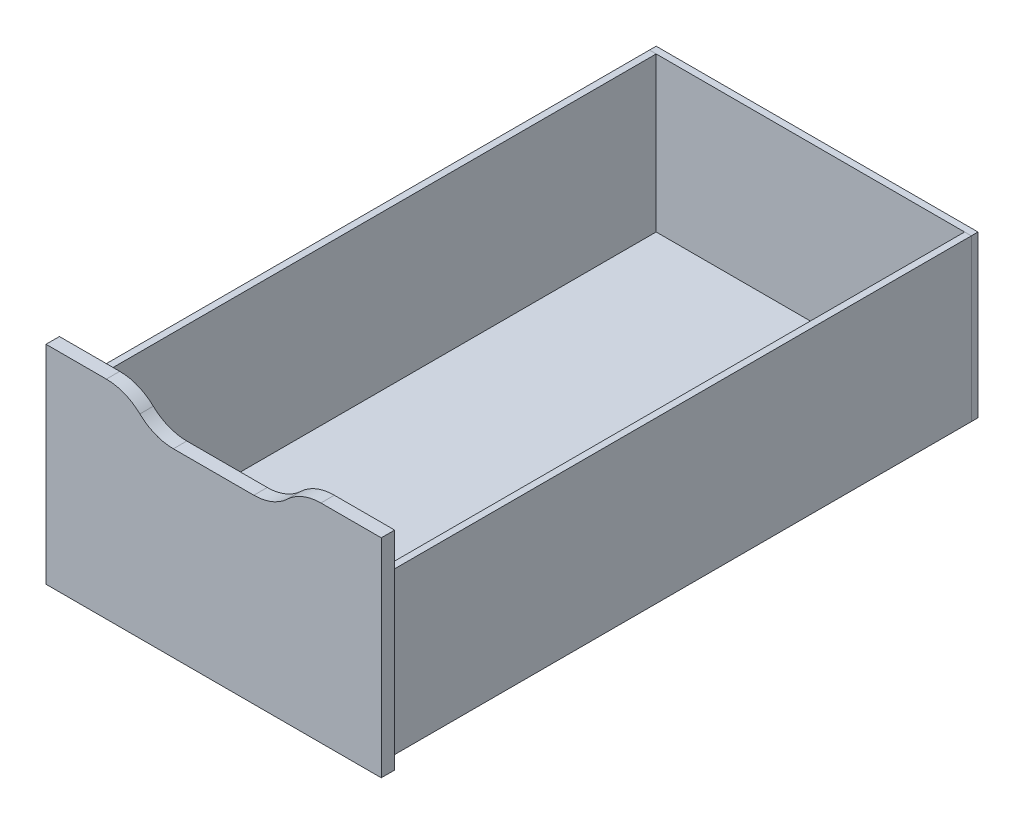
ISO-10303-21;
HEADER;
FILE_DESCRIPTION(('STEP AP214'),'2;1');
FILE_NAME('part.step','',(''),(''),'','','');
FILE_SCHEMA(('AUTOMOTIVE_DESIGN { 1 0 10303 214 1 1 1 1 }'));
ENDSEC;
DATA;
#1=APPLICATION_CONTEXT('core data for automotive mechanical design processes');
#2=APPLICATION_PROTOCOL_DEFINITION('international standard','automotive_design',2000,#1);
#3=PRODUCT_CONTEXT('',#1,'mechanical');
#4=PRODUCT('Part','Part','',(#3));
#5=PRODUCT_RELATED_PRODUCT_CATEGORY('part','',(#4));
#6=PRODUCT_DEFINITION_FORMATION('','',#4);
#7=PRODUCT_DEFINITION_CONTEXT('part definition',#1,'design');
#8=PRODUCT_DEFINITION('design','',#6,#7);
#9=PRODUCT_DEFINITION_SHAPE('','',#8);
#10=(LENGTH_UNIT() NAMED_UNIT(*) SI_UNIT(.MILLI.,.METRE.));
#11=(NAMED_UNIT(*) PLANE_ANGLE_UNIT() SI_UNIT($,.RADIAN.));
#12=(NAMED_UNIT(*) SI_UNIT($,.STERADIAN.) SOLID_ANGLE_UNIT());
#13=UNCERTAINTY_MEASURE_WITH_UNIT(LENGTH_MEASURE(1.E-05),#10,'distance_accuracy_value','');
#14=(GEOMETRIC_REPRESENTATION_CONTEXT(3) GLOBAL_UNCERTAINTY_ASSIGNED_CONTEXT((#13)) GLOBAL_UNIT_ASSIGNED_CONTEXT((#10,
#11,#12)) REPRESENTATION_CONTEXT('',''));
#15=CARTESIAN_POINT('',(0.,0.,0.));
#16=DIRECTION('',(0.,0.,1.));
#17=DIRECTION('',(1.,0.,0.));
#18=AXIS2_PLACEMENT_3D('',#15,#16,#17);
#19=CARTESIAN_POINT('',(152.4,0.,-279.4));
#20=DIRECTION('',(-1.,0.,0.));
#21=DIRECTION('',(0.,0.,1.));
#22=AXIS2_PLACEMENT_3D('',#19,#20,#21);
#23=PLANE('',#22);
#24=DIRECTION('',(0.,-1.,0.));
#25=VECTOR('',#24,1.);
#26=CARTESIAN_POINT('',(152.4,0.,-273.05));
#27=LINE('',#26,#25);
#28=CARTESIAN_POINT('',(152.4,152.4,-273.05));
#29=VERTEX_POINT('',#28);
#30=CARTESIAN_POINT('',(152.4,0.,-273.05));
#31=VERTEX_POINT('',#30);
#32=EDGE_CURVE('E117',#29,#31,#27,.T.);
#33=ORIENTED_EDGE('',*,*,#32,.T.);
#34=DIRECTION('',(0.,0.,1.));
#35=VECTOR('',#34,1.);
#36=CARTESIAN_POINT('',(152.4,0.,-279.4));
#37=LINE('',#36,#35);
#38=CARTESIAN_POINT('',(152.4,0.,-279.4));
#39=VERTEX_POINT('',#38);
#40=EDGE_CURVE('E12',#39,#31,#37,.T.);
#41=ORIENTED_EDGE('',*,*,#40,.F.);
#42=DIRECTION('',(0.,-1.,0.));
#43=VECTOR('',#42,1.);
#44=CARTESIAN_POINT('',(152.4,0.,-279.4));
#45=LINE('',#44,#43);
#46=CARTESIAN_POINT('',(152.4,152.4,-279.4));
#47=VERTEX_POINT('',#46);
#48=EDGE_CURVE('E105',#47,#39,#45,.T.);
#49=ORIENTED_EDGE('',*,*,#48,.F.);
#50=DIRECTION('',(0.,0.,1.));
#51=VECTOR('',#50,1.);
#52=CARTESIAN_POINT('',(152.4,152.4,-279.4));
#53=LINE('',#52,#51);
#54=EDGE_CURVE('E113',#47,#29,#53,.T.);
#55=ORIENTED_EDGE('',*,*,#54,.T.);
#56=EDGE_LOOP('',(#33,#41,#49,#55));
#57=FACE_BOUND('',#56,.T.);
#58=ADVANCED_FACE('F54',(#57),#23,.F.);
#59=CARTESIAN_POINT('',(152.4,0.,-279.4));
#60=DIRECTION('',(0.,1.,0.));
#61=DIRECTION('',(0.,0.,1.));
#62=AXIS2_PLACEMENT_3D('',#59,#60,#61);
#63=PLANE('',#62);
#64=DIRECTION('',(-1.,0.,0.));
#65=VECTOR('',#64,1.);
#66=CARTESIAN_POINT('',(152.4,0.,-273.05));
#67=LINE('',#66,#65);
#68=CARTESIAN_POINT('',(-152.4,0.,-273.05));
#69=VERTEX_POINT('',#68);
#70=EDGE_CURVE('E109',#31,#69,#67,.T.);
#71=ORIENTED_EDGE('',*,*,#70,.T.);
#72=DIRECTION('',(0.,0.,1.));
#73=VECTOR('',#72,1.);
#74=CARTESIAN_POINT('',(-152.4,0.,-279.4));
#75=LINE('',#74,#73);
#76=CARTESIAN_POINT('',(-152.4,0.,-279.4));
#77=VERTEX_POINT('',#76);
#78=EDGE_CURVE('E62',#77,#69,#75,.T.);
#79=ORIENTED_EDGE('',*,*,#78,.F.);
#80=DIRECTION('',(-1.,0.,0.));
#81=VECTOR('',#80,1.);
#82=CARTESIAN_POINT('',(152.4,0.,-279.4));
#83=LINE('',#82,#81);
#84=EDGE_CURVE('E100',#39,#77,#83,.T.);
#85=ORIENTED_EDGE('',*,*,#84,.F.);
#86=ORIENTED_EDGE('',*,*,#40,.T.);
#87=EDGE_LOOP('',(#71,#79,#85,#86));
#88=FACE_BOUND('',#87,.T.);
#89=ADVANCED_FACE('F108',(#88),#63,.F.);
#90=CARTESIAN_POINT('',(-152.4,0.,-279.4));
#91=DIRECTION('',(1.,0.,0.));
#92=DIRECTION('',(0.,0.,-1.));
#93=AXIS2_PLACEMENT_3D('',#90,#91,#92);
#94=PLANE('',#93);
#95=DIRECTION('',(0.,1.,0.));
#96=VECTOR('',#95,1.);
#97=CARTESIAN_POINT('',(-152.4,0.,-273.05));
#98=LINE('',#97,#96);
#99=CARTESIAN_POINT('',(-152.4,152.4,-273.05));
#100=VERTEX_POINT('',#99);
#101=EDGE_CURVE('E87',#69,#100,#98,.T.);
#102=ORIENTED_EDGE('',*,*,#101,.T.);
#103=DIRECTION('',(0.,0.,1.));
#104=VECTOR('',#103,1.);
#105=CARTESIAN_POINT('',(-152.4,152.4,-279.4));
#106=LINE('',#105,#104);
#107=CARTESIAN_POINT('',(-152.4,152.4,-279.4));
#108=VERTEX_POINT('',#107);
#109=EDGE_CURVE('E110',#108,#100,#106,.T.);
#110=ORIENTED_EDGE('',*,*,#109,.F.);
#111=DIRECTION('',(0.,1.,0.));
#112=VECTOR('',#111,1.);
#113=CARTESIAN_POINT('',(-152.4,0.,-279.4));
#114=LINE('',#113,#112);
#115=EDGE_CURVE('E103',#77,#108,#114,.T.);
#116=ORIENTED_EDGE('',*,*,#115,.F.);
#117=ORIENTED_EDGE('',*,*,#78,.T.);
#118=EDGE_LOOP('',(#102,#110,#116,#117));
#119=FACE_BOUND('',#118,.T.);
#120=ADVANCED_FACE('F111',(#119),#94,.F.);
#121=CARTESIAN_POINT('',(152.4,152.4,-279.4));
#122=DIRECTION('',(0.,-1.,0.));
#123=DIRECTION('',(0.,0.,-1.));
#124=AXIS2_PLACEMENT_3D('',#121,#122,#123);
#125=PLANE('',#124);
#126=DIRECTION('',(1.,0.,0.));
#127=VECTOR('',#126,1.);
#128=CARTESIAN_POINT('',(152.4,152.4,-273.05));
#129=LINE('',#128,#127);
#130=EDGE_CURVE('E93',#100,#29,#129,.T.);
#131=ORIENTED_EDGE('',*,*,#130,.T.);
#132=ORIENTED_EDGE('',*,*,#54,.F.);
#133=DIRECTION('',(1.,0.,0.));
#134=VECTOR('',#133,1.);
#135=CARTESIAN_POINT('',(152.4,152.4,-279.4));
#136=LINE('',#135,#134);
#137=EDGE_CURVE('E70',#108,#47,#136,.T.);
#138=ORIENTED_EDGE('',*,*,#137,.F.);
#139=ORIENTED_EDGE('',*,*,#109,.T.);
#140=EDGE_LOOP('',(#131,#132,#138,#139));
#141=FACE_BOUND('',#140,.T.);
#142=ADVANCED_FACE('F124',(#141),#125,.F.);
#143=CARTESIAN_POINT('',(0.,0.,-279.4));
#144=DIRECTION('',(0.,0.,1.));
#145=DIRECTION('',(1.,0.,0.));
#146=AXIS2_PLACEMENT_3D('',#143,#144,#145);
#147=PLANE('',#146);
#148=ORIENTED_EDGE('',*,*,#48,.T.);
#149=ORIENTED_EDGE('',*,*,#84,.T.);
#150=ORIENTED_EDGE('',*,*,#115,.T.);
#151=ORIENTED_EDGE('',*,*,#137,.T.);
#152=EDGE_LOOP('',(#148,#149,#150,#151));
#153=FACE_BOUND('',#152,.T.);
#154=ADVANCED_FACE('F101',(#153),#147,.F.);
#155=CARTESIAN_POINT('',(0.,0.,-273.05));
#156=DIRECTION('',(0.,0.,1.));
#157=DIRECTION('',(1.,0.,0.));
#158=AXIS2_PLACEMENT_3D('',#155,#156,#157);
#159=PLANE('',#158);
#160=ORIENTED_EDGE('',*,*,#32,.F.);
#161=ORIENTED_EDGE('',*,*,#130,.F.);
#162=ORIENTED_EDGE('',*,*,#101,.F.);
#163=ORIENTED_EDGE('',*,*,#70,.F.);
#164=EDGE_LOOP('',(#160,#161,#162,#163));
#165=FACE_BOUND('',#164,.T.);
#166=ADVANCED_FACE('F127',(#165),#159,.T.);
#167=CLOSED_SHELL('',(#58,#89,#120,#142,#154,#166));
#168=MANIFOLD_SOLID_BREP('B2',#167);
#169=CARTESIAN_POINT('',(-152.4,0.,279.4));
#170=DIRECTION('',(0.,0.,-1.));
#171=DIRECTION('',(0.,1.,0.));
#172=AXIS2_PLACEMENT_3D('',#169,#170,#171);
#173=PLANE('',#172);
#174=DIRECTION('',(0.,-1.,0.));
#175=VECTOR('',#174,1.);
#176=CARTESIAN_POINT('',(-146.05,0.,279.4));
#177=LINE('',#176,#175);
#178=CARTESIAN_POINT('',(-146.05,152.4,279.4));
#179=VERTEX_POINT('',#178);
#180=CARTESIAN_POINT('',(-146.05,0.,279.4));
#181=VERTEX_POINT('',#180);
#182=EDGE_CURVE('E263',#179,#181,#177,.T.);
#183=ORIENTED_EDGE('',*,*,#182,.F.);
#184=DIRECTION('',(1.,0.,0.));
#185=VECTOR('',#184,1.);
#186=CARTESIAN_POINT('',(-152.4,152.4,279.4));
#187=LINE('',#186,#185);
#188=CARTESIAN_POINT('',(-152.4,152.4,279.4));
#189=VERTEX_POINT('',#188);
#190=EDGE_CURVE('E262',#189,#179,#187,.T.);
#191=ORIENTED_EDGE('',*,*,#190,.F.);
#192=DIRECTION('',(0.,-1.,0.));
#193=VECTOR('',#192,1.);
#194=CARTESIAN_POINT('',(-152.4,0.,279.4));
#195=LINE('',#194,#193);
#196=CARTESIAN_POINT('',(-152.4,0.,279.4));
#197=VERTEX_POINT('',#196);
#198=EDGE_CURVE('E257',#189,#197,#195,.T.);
#199=ORIENTED_EDGE('',*,*,#198,.T.);
#200=DIRECTION('',(1.,0.,0.));
#201=VECTOR('',#200,1.);
#202=CARTESIAN_POINT('',(-152.4,0.,279.4));
#203=LINE('',#202,#201);
#204=EDGE_CURVE('E52',#197,#181,#203,.T.);
#205=ORIENTED_EDGE('',*,*,#204,.T.);
#206=EDGE_LOOP('',(#183,#191,#199,#205));
#207=FACE_BOUND('',#206,.T.);
#208=ADVANCED_FACE('F200',(#207),#173,.F.);
#209=CARTESIAN_POINT('',(-152.4,0.,279.4));
#210=DIRECTION('',(0.,1.,0.));
#211=DIRECTION('',(0.,0.,1.));
#212=AXIS2_PLACEMENT_3D('',#209,#210,#211);
#213=PLANE('',#212);
#214=DIRECTION('',(0.,0.,-1.));
#215=VECTOR('',#214,1.);
#216=CARTESIAN_POINT('',(-146.05,0.,279.4));
#217=LINE('',#216,#215);
#218=CARTESIAN_POINT('',(-146.05,0.,-273.05));
#219=VERTEX_POINT('',#218);
#220=EDGE_CURVE('E265',#181,#219,#217,.T.);
#221=ORIENTED_EDGE('',*,*,#220,.F.);
#222=ORIENTED_EDGE('',*,*,#204,.F.);
#223=DIRECTION('',(0.,0.,-1.));
#224=VECTOR('',#223,1.);
#225=CARTESIAN_POINT('',(-152.4,0.,279.4));
#226=LINE('',#225,#224);
#227=CARTESIAN_POINT('',(-152.4,0.,-273.05));
#228=VERTEX_POINT('',#227);
#229=EDGE_CURVE('E241',#197,#228,#226,.T.);
#230=ORIENTED_EDGE('',*,*,#229,.T.);
#231=DIRECTION('',(1.,0.,0.));
#232=VECTOR('',#231,1.);
#233=CARTESIAN_POINT('',(-152.4,0.,-273.05));
#234=LINE('',#233,#232);
#235=EDGE_CURVE('E208',#228,#219,#234,.T.);
#236=ORIENTED_EDGE('',*,*,#235,.T.);
#237=EDGE_LOOP('',(#221,#222,#230,#236));
#238=FACE_BOUND('',#237,.T.);
#239=ADVANCED_FACE('F255',(#238),#213,.F.);
#240=CARTESIAN_POINT('',(-152.4,0.,-273.05));
#241=DIRECTION('',(0.,0.,1.));
#242=DIRECTION('',(0.,-1.,0.));
#243=AXIS2_PLACEMENT_3D('',#240,#241,#242);
#244=PLANE('',#243);
#245=DIRECTION('',(0.,1.,0.));
#246=VECTOR('',#245,1.);
#247=CARTESIAN_POINT('',(-146.05,0.,-273.05));
#248=LINE('',#247,#246);
#249=CARTESIAN_POINT('',(-146.05,152.4,-273.05));
#250=VERTEX_POINT('',#249);
#251=EDGE_CURVE('E251',#219,#250,#248,.T.);
#252=ORIENTED_EDGE('',*,*,#251,.F.);
#253=ORIENTED_EDGE('',*,*,#235,.F.);
#254=DIRECTION('',(0.,1.,0.));
#255=VECTOR('',#254,1.);
#256=CARTESIAN_POINT('',(-152.4,0.,-273.05));
#257=LINE('',#256,#255);
#258=CARTESIAN_POINT('',(-152.4,152.4,-273.05));
#259=VERTEX_POINT('',#258);
#260=EDGE_CURVE('E244',#228,#259,#257,.T.);
#261=ORIENTED_EDGE('',*,*,#260,.T.);
#262=DIRECTION('',(1.,0.,0.));
#263=VECTOR('',#262,1.);
#264=CARTESIAN_POINT('',(-152.4,152.4,-273.05));
#265=LINE('',#264,#263);
#266=EDGE_CURVE('E254',#259,#250,#265,.T.);
#267=ORIENTED_EDGE('',*,*,#266,.T.);
#268=EDGE_LOOP('',(#252,#253,#261,#267));
#269=FACE_BOUND('',#268,.T.);
#270=ADVANCED_FACE('F250',(#269),#244,.F.);
#271=CARTESIAN_POINT('',(-152.4,152.4,279.4));
#272=DIRECTION('',(0.,-1.,0.));
#273=DIRECTION('',(0.,0.,-1.));
#274=AXIS2_PLACEMENT_3D('',#271,#272,#273);
#275=PLANE('',#274);
#276=DIRECTION('',(0.,0.,1.));
#277=VECTOR('',#276,1.);
#278=CARTESIAN_POINT('',(-146.05,152.4,279.4));
#279=LINE('',#278,#277);
#280=EDGE_CURVE('E230',#250,#179,#279,.T.);
#281=ORIENTED_EDGE('',*,*,#280,.F.);
#282=ORIENTED_EDGE('',*,*,#266,.F.);
#283=DIRECTION('',(0.,0.,1.));
#284=VECTOR('',#283,1.);
#285=CARTESIAN_POINT('',(-152.4,152.4,279.4));
#286=LINE('',#285,#284);
#287=EDGE_CURVE('E216',#259,#189,#286,.T.);
#288=ORIENTED_EDGE('',*,*,#287,.T.);
#289=ORIENTED_EDGE('',*,*,#190,.T.);
#290=EDGE_LOOP('',(#281,#282,#288,#289));
#291=FACE_BOUND('',#290,.T.);
#292=ADVANCED_FACE('F274',(#291),#275,.F.);
#293=CARTESIAN_POINT('',(-152.4,0.,0.));
#294=DIRECTION('',(1.,0.,0.));
#295=DIRECTION('',(0.,0.,1.));
#296=AXIS2_PLACEMENT_3D('',#293,#294,#295);
#297=PLANE('',#296);
#298=ORIENTED_EDGE('',*,*,#198,.F.);
#299=ORIENTED_EDGE('',*,*,#287,.F.);
#300=ORIENTED_EDGE('',*,*,#260,.F.);
#301=ORIENTED_EDGE('',*,*,#229,.F.);
#302=EDGE_LOOP('',(#298,#299,#300,#301));
#303=FACE_BOUND('',#302,.T.);
#304=ADVANCED_FACE('F246',(#303),#297,.F.);
#305=CARTESIAN_POINT('',(-146.05,0.,0.));
#306=DIRECTION('',(1.,0.,0.));
#307=DIRECTION('',(0.,0.,1.));
#308=AXIS2_PLACEMENT_3D('',#305,#306,#307);
#309=PLANE('',#308);
#310=ORIENTED_EDGE('',*,*,#182,.T.);
#311=ORIENTED_EDGE('',*,*,#220,.T.);
#312=ORIENTED_EDGE('',*,*,#251,.T.);
#313=ORIENTED_EDGE('',*,*,#280,.T.);
#314=EDGE_LOOP('',(#310,#311,#312,#313));
#315=FACE_BOUND('',#314,.T.);
#316=ADVANCED_FACE('F270',(#315),#309,.T.);
#317=CLOSED_SHELL('',(#208,#239,#270,#292,#304,#316));
#318=MANIFOLD_SOLID_BREP('B6',#317);
#319=CARTESIAN_POINT('',(152.4,0.,279.4));
#320=DIRECTION('',(0.,0.,-1.));
#321=DIRECTION('',(0.,1.,0.));
#322=AXIS2_PLACEMENT_3D('',#319,#320,#321);
#323=PLANE('',#322);
#324=DIRECTION('',(0.,-1.,0.));
#325=VECTOR('',#324,1.);
#326=CARTESIAN_POINT('',(146.05,0.,279.4));
#327=LINE('',#326,#325);
#328=CARTESIAN_POINT('',(146.05,152.4,279.4));
#329=VERTEX_POINT('',#328);
#330=CARTESIAN_POINT('',(146.05,0.,279.4));
#331=VERTEX_POINT('',#330);
#332=EDGE_CURVE('E409',#329,#331,#327,.T.);
#333=ORIENTED_EDGE('',*,*,#332,.T.);
#334=DIRECTION('',(-1.,0.,0.));
#335=VECTOR('',#334,1.);
#336=CARTESIAN_POINT('',(152.4,0.,279.4));
#337=LINE('',#336,#335);
#338=CARTESIAN_POINT('',(152.4,0.,279.4));
#339=VERTEX_POINT('',#338);
#340=EDGE_CURVE('E198',#339,#331,#337,.T.);
#341=ORIENTED_EDGE('',*,*,#340,.F.);
#342=DIRECTION('',(0.,-1.,0.));
#343=VECTOR('',#342,1.);
#344=CARTESIAN_POINT('',(152.4,0.,279.4));
#345=LINE('',#344,#343);
#346=CARTESIAN_POINT('',(152.4,152.4,279.4));
#347=VERTEX_POINT('',#346);
#348=EDGE_CURVE('E397',#347,#339,#345,.T.);
#349=ORIENTED_EDGE('',*,*,#348,.F.);
#350=DIRECTION('',(-1.,0.,0.));
#351=VECTOR('',#350,1.);
#352=CARTESIAN_POINT('',(152.4,152.4,279.4));
#353=LINE('',#352,#351);
#354=EDGE_CURVE('E405',#347,#329,#353,.T.);
#355=ORIENTED_EDGE('',*,*,#354,.T.);
#356=EDGE_LOOP('',(#333,#341,#349,#355));
#357=FACE_BOUND('',#356,.T.);
#358=ADVANCED_FACE('F346',(#357),#323,.F.);
#359=CARTESIAN_POINT('',(152.4,0.,279.4));
#360=DIRECTION('',(0.,1.,0.));
#361=DIRECTION('',(0.,0.,1.));
#362=AXIS2_PLACEMENT_3D('',#359,#360,#361);
#363=PLANE('',#362);
#364=DIRECTION('',(0.,0.,-1.));
#365=VECTOR('',#364,1.);
#366=CARTESIAN_POINT('',(146.05,0.,279.4));
#367=LINE('',#366,#365);
#368=CARTESIAN_POINT('',(146.05,0.,-273.05));
#369=VERTEX_POINT('',#368);
#370=EDGE_CURVE('E401',#331,#369,#367,.T.);
#371=ORIENTED_EDGE('',*,*,#370,.T.);
#372=DIRECTION('',(-1.,0.,0.));
#373=VECTOR('',#372,1.);
#374=CARTESIAN_POINT('',(152.4,0.,-273.05));
#375=LINE('',#374,#373);
#376=CARTESIAN_POINT('',(152.4,0.,-273.05));
#377=VERTEX_POINT('',#376);
#378=EDGE_CURVE('E354',#377,#369,#375,.T.);
#379=ORIENTED_EDGE('',*,*,#378,.F.);
#380=DIRECTION('',(0.,0.,-1.));
#381=VECTOR('',#380,1.);
#382=CARTESIAN_POINT('',(152.4,0.,279.4));
#383=LINE('',#382,#381);
#384=EDGE_CURVE('E392',#339,#377,#383,.T.);
#385=ORIENTED_EDGE('',*,*,#384,.F.);
#386=ORIENTED_EDGE('',*,*,#340,.T.);
#387=EDGE_LOOP('',(#371,#379,#385,#386));
#388=FACE_BOUND('',#387,.T.);
#389=ADVANCED_FACE('F400',(#388),#363,.F.);
#390=CARTESIAN_POINT('',(152.4,0.,-273.05));
#391=DIRECTION('',(0.,0.,1.));
#392=DIRECTION('',(0.,-1.,0.));
#393=AXIS2_PLACEMENT_3D('',#390,#391,#392);
#394=PLANE('',#393);
#395=DIRECTION('',(0.,1.,0.));
#396=VECTOR('',#395,1.);
#397=CARTESIAN_POINT('',(146.05,0.,-273.05));
#398=LINE('',#397,#396);
#399=CARTESIAN_POINT('',(146.05,152.4,-273.05));
#400=VERTEX_POINT('',#399);
#401=EDGE_CURVE('E379',#369,#400,#398,.T.);
#402=ORIENTED_EDGE('',*,*,#401,.T.);
#403=DIRECTION('',(-1.,0.,0.));
#404=VECTOR('',#403,1.);
#405=CARTESIAN_POINT('',(152.4,152.4,-273.05));
#406=LINE('',#405,#404);
#407=CARTESIAN_POINT('',(152.4,152.4,-273.05));
#408=VERTEX_POINT('',#407);
#409=EDGE_CURVE('E402',#408,#400,#406,.T.);
#410=ORIENTED_EDGE('',*,*,#409,.F.);
#411=DIRECTION('',(0.,1.,0.));
#412=VECTOR('',#411,1.);
#413=CARTESIAN_POINT('',(152.4,0.,-273.05));
#414=LINE('',#413,#412);
#415=EDGE_CURVE('E395',#377,#408,#414,.T.);
#416=ORIENTED_EDGE('',*,*,#415,.F.);
#417=ORIENTED_EDGE('',*,*,#378,.T.);
#418=EDGE_LOOP('',(#402,#410,#416,#417));
#419=FACE_BOUND('',#418,.T.);
#420=ADVANCED_FACE('F403',(#419),#394,.F.);
#421=CARTESIAN_POINT('',(152.4,152.4,279.4));
#422=DIRECTION('',(0.,-1.,0.));
#423=DIRECTION('',(0.,0.,-1.));
#424=AXIS2_PLACEMENT_3D('',#421,#422,#423);
#425=PLANE('',#424);
#426=DIRECTION('',(0.,0.,1.));
#427=VECTOR('',#426,1.);
#428=CARTESIAN_POINT('',(146.05,152.4,279.4));
#429=LINE('',#428,#427);
#430=EDGE_CURVE('E385',#400,#329,#429,.T.);
#431=ORIENTED_EDGE('',*,*,#430,.T.);
#432=ORIENTED_EDGE('',*,*,#354,.F.);
#433=DIRECTION('',(0.,0.,1.));
#434=VECTOR('',#433,1.);
#435=CARTESIAN_POINT('',(152.4,152.4,279.4));
#436=LINE('',#435,#434);
#437=EDGE_CURVE('E362',#408,#347,#436,.T.);
#438=ORIENTED_EDGE('',*,*,#437,.F.);
#439=ORIENTED_EDGE('',*,*,#409,.T.);
#440=EDGE_LOOP('',(#431,#432,#438,#439));
#441=FACE_BOUND('',#440,.T.);
#442=ADVANCED_FACE('F416',(#441),#425,.F.);
#443=CARTESIAN_POINT('',(152.4,0.,0.));
#444=DIRECTION('',(-1.,0.,0.));
#445=DIRECTION('',(0.,0.,1.));
#446=AXIS2_PLACEMENT_3D('',#443,#444,#445);
#447=PLANE('',#446);
#448=ORIENTED_EDGE('',*,*,#348,.T.);
#449=ORIENTED_EDGE('',*,*,#384,.T.);
#450=ORIENTED_EDGE('',*,*,#415,.T.);
#451=ORIENTED_EDGE('',*,*,#437,.T.);
#452=EDGE_LOOP('',(#448,#449,#450,#451));
#453=FACE_BOUND('',#452,.T.);
#454=ADVANCED_FACE('F393',(#453),#447,.F.);
#455=CARTESIAN_POINT('',(146.05,0.,0.));
#456=DIRECTION('',(-1.,0.,0.));
#457=DIRECTION('',(0.,0.,1.));
#458=AXIS2_PLACEMENT_3D('',#455,#456,#457);
#459=PLANE('',#458);
#460=ORIENTED_EDGE('',*,*,#332,.F.);
#461=ORIENTED_EDGE('',*,*,#430,.F.);
#462=ORIENTED_EDGE('',*,*,#401,.F.);
#463=ORIENTED_EDGE('',*,*,#370,.F.);
#464=EDGE_LOOP('',(#460,#461,#462,#463));
#465=FACE_BOUND('',#464,.T.);
#466=ADVANCED_FACE('F419',(#465),#459,.T.);
#467=CLOSED_SHELL('',(#358,#389,#420,#442,#454,#466));
#468=MANIFOLD_SOLID_BREP('B46',#467);
#469=CARTESIAN_POINT('',(-158.75,190.5,292.1));
#470=DIRECTION('',(0.,-1.,0.));
#471=DIRECTION('',(0.,0.,-1.));
#472=AXIS2_PLACEMENT_3D('',#469,#470,#471);
#473=PLANE('',#472);
#474=DIRECTION('',(0.,0.,1.));
#475=VECTOR('',#474,1.);
#476=CARTESIAN_POINT('',(101.6,190.5,-273.05));
#477=LINE('',#476,#475);
#478=CARTESIAN_POINT('',(101.6,190.5,279.4));
#479=VERTEX_POINT('',#478);
#480=CARTESIAN_POINT('',(101.6,190.5,292.1));
#481=VERTEX_POINT('',#480);
#482=EDGE_CURVE('E602',#479,#481,#477,.T.);
#483=ORIENTED_EDGE('',*,*,#482,.T.);
#484=DIRECTION('',(-1.,0.,0.));
#485=VECTOR('',#484,1.);
#486=CARTESIAN_POINT('',(-158.75,190.5,292.1));
#487=LINE('',#486,#485);
#488=CARTESIAN_POINT('',(158.75,190.5,292.1));
#489=VERTEX_POINT('',#488);
#490=EDGE_CURVE('E592',#489,#481,#487,.T.);
#491=ORIENTED_EDGE('',*,*,#490,.F.);
#492=DIRECTION('',(0.,0.,-1.));
#493=VECTOR('',#492,1.);
#494=CARTESIAN_POINT('',(158.75,190.5,292.1));
#495=LINE('',#494,#493);
#496=CARTESIAN_POINT('',(158.75,190.5,279.4));
#497=VERTEX_POINT('',#496);
#498=EDGE_CURVE('E611',#489,#497,#495,.T.);
#499=ORIENTED_EDGE('',*,*,#498,.T.);
#500=DIRECTION('',(-1.,0.,0.));
#501=VECTOR('',#500,1.);
#502=CARTESIAN_POINT('',(-158.75,190.5,279.4));
#503=LINE('',#502,#501);
#504=EDGE_CURVE('E606',#497,#479,#503,.T.);
#505=ORIENTED_EDGE('',*,*,#504,.T.);
#506=EDGE_LOOP('',(#483,#491,#499,#505));
#507=FACE_BOUND('',#506,.T.);
#508=ADVANCED_FACE('F491',(#507),#473,.F.);
#509=CARTESIAN_POINT('',(0.,0.,292.1));
#510=DIRECTION('',(0.,0.,-1.));
#511=DIRECTION('',(-1.,0.,0.));
#512=AXIS2_PLACEMENT_3D('',#509,#510,#511);
#513=PLANE('',#512);
#514=ORIENTED_EDGE('',*,*,#490,.T.);
#515=CARTESIAN_POINT('',(101.6,144.4625,292.1));
#516=DIRECTION('',(0.,0.,-1.));
#517=DIRECTION('',(1.,0.,0.));
#518=AXIS2_PLACEMENT_3D('',#515,#516,#517);
#519=CIRCLE('',#518,46.0375000000001);
#520=CARTESIAN_POINT('',(69.85,177.8,292.1));
#521=VERTEX_POINT('',#520);
#522=EDGE_CURVE('E581',#521,#481,#519,.T.);
#523=ORIENTED_EDGE('',*,*,#522,.F.);
#524=CARTESIAN_POINT('',(38.1,211.1375,292.1));
#525=DIRECTION('',(0.,0.,1.));
#526=DIRECTION('',(-1.,0.,0.));
#527=AXIS2_PLACEMENT_3D('',#524,#525,#526);
#528=CIRCLE('',#527,46.0375000000001);
#529=CARTESIAN_POINT('',(38.1,165.1,292.1));
#530=VERTEX_POINT('',#529);
#531=EDGE_CURVE('E662',#530,#521,#528,.T.);
#532=ORIENTED_EDGE('',*,*,#531,.F.);
#533=DIRECTION('',(1.,0.,0.));
#534=VECTOR('',#533,1.);
#535=CARTESIAN_POINT('',(38.1,165.1,292.1));
#536=LINE('',#535,#534);
#537=CARTESIAN_POINT('',(-38.1,165.1,292.1));
#538=VERTEX_POINT('',#537);
#539=EDGE_CURVE('E638',#538,#530,#536,.T.);
#540=ORIENTED_EDGE('',*,*,#539,.F.);
#541=CARTESIAN_POINT('',(-38.1,211.1375,292.1));
#542=DIRECTION('',(0.,0.,1.));
#543=DIRECTION('',(-1.,0.,0.));
#544=AXIS2_PLACEMENT_3D('',#541,#542,#543);
#545=CIRCLE('',#544,46.0375000000001);
#546=CARTESIAN_POINT('',(-69.85,177.8,292.1));
#547=VERTEX_POINT('',#546);
#548=EDGE_CURVE('E587',#547,#538,#545,.T.);
#549=ORIENTED_EDGE('',*,*,#548,.F.);
#550=CARTESIAN_POINT('',(-101.6,144.4625,292.1));
#551=DIRECTION('',(0.,0.,-1.));
#552=DIRECTION('',(1.,0.,0.));
#553=AXIS2_PLACEMENT_3D('',#550,#551,#552);
#554=CIRCLE('',#553,46.0375000000001);
#555=CARTESIAN_POINT('',(-101.6,190.5,292.1));
#556=VERTEX_POINT('',#555);
#557=EDGE_CURVE('E577',#556,#547,#554,.T.);
#558=ORIENTED_EDGE('',*,*,#557,.F.);
#559=CARTESIAN_POINT('',(-158.75,190.5,292.1));
#560=VERTEX_POINT('',#559);
#561=EDGE_CURVE('E515',#556,#560,#487,.T.);
#562=ORIENTED_EDGE('',*,*,#561,.T.);
#563=DIRECTION('',(0.,-1.,0.));
#564=VECTOR('',#563,1.);
#565=CARTESIAN_POINT('',(-158.75,-6.35,292.1));
#566=LINE('',#565,#564);
#567=CARTESIAN_POINT('',(-158.75,-6.35,292.1));
#568=VERTEX_POINT('',#567);
#569=EDGE_CURVE('E609',#560,#568,#566,.T.);
#570=ORIENTED_EDGE('',*,*,#569,.T.);
#571=DIRECTION('',(1.,0.,0.));
#572=VECTOR('',#571,1.);
#573=CARTESIAN_POINT('',(-158.75,-6.35,292.1));
#574=LINE('',#573,#572);
#575=CARTESIAN_POINT('',(158.75,-6.35,292.1));
#576=VERTEX_POINT('',#575);
#577=EDGE_CURVE('E545',#568,#576,#574,.T.);
#578=ORIENTED_EDGE('',*,*,#577,.T.);
#579=DIRECTION('',(0.,1.,0.));
#580=VECTOR('',#579,1.);
#581=CARTESIAN_POINT('',(158.75,-6.35,292.1));
#582=LINE('',#581,#580);
#583=EDGE_CURVE('E593',#576,#489,#582,.T.);
#584=ORIENTED_EDGE('',*,*,#583,.T.);
#585=EDGE_LOOP('',(#514,#523,#532,#540,#549,#558,#562,#570,#578,#584));
#586=FACE_BOUND('',#585,.T.);
#587=ADVANCED_FACE('F584',(#586),#513,.F.);
#588=CARTESIAN_POINT('',(0.,0.,279.4));
#589=DIRECTION('',(0.,0.,-1.));
#590=DIRECTION('',(-1.,0.,0.));
#591=AXIS2_PLACEMENT_3D('',#588,#589,#590);
#592=PLANE('',#591);
#593=CARTESIAN_POINT('',(101.6,144.4625,279.4));
#594=DIRECTION('',(0.,0.,-1.));
#595=DIRECTION('',(-1.,0.,0.));
#596=AXIS2_PLACEMENT_3D('',#593,#594,#595);
#597=CIRCLE('',#596,46.0375000000001);
#598=CARTESIAN_POINT('',(69.85,177.8,279.4));
#599=VERTEX_POINT('',#598);
#600=EDGE_CURVE('E344',#479,#599,#597,.F.);
#601=ORIENTED_EDGE('',*,*,#600,.F.);
#602=ORIENTED_EDGE('',*,*,#504,.F.);
#603=DIRECTION('',(0.,1.,0.));
#604=VECTOR('',#603,1.);
#605=CARTESIAN_POINT('',(158.75,-6.35,279.4));
#606=LINE('',#605,#604);
#607=CARTESIAN_POINT('',(158.75,-6.35,279.4));
#608=VERTEX_POINT('',#607);
#609=EDGE_CURVE('E604',#608,#497,#606,.T.);
#610=ORIENTED_EDGE('',*,*,#609,.F.);
#611=DIRECTION('',(1.,0.,0.));
#612=VECTOR('',#611,1.);
#613=CARTESIAN_POINT('',(-158.75,-6.35,279.4));
#614=LINE('',#613,#612);
#615=CARTESIAN_POINT('',(-158.75,-6.35,279.4));
#616=VERTEX_POINT('',#615);
#617=EDGE_CURVE('E601',#616,#608,#614,.T.);
#618=ORIENTED_EDGE('',*,*,#617,.F.);
#619=DIRECTION('',(0.,-1.,0.));
#620=VECTOR('',#619,1.);
#621=CARTESIAN_POINT('',(-158.75,-6.35,279.4));
#622=LINE('',#621,#620);
#623=CARTESIAN_POINT('',(-158.75,190.5,279.4));
#624=VERTEX_POINT('',#623);
#625=EDGE_CURVE('E598',#624,#616,#622,.T.);
#626=ORIENTED_EDGE('',*,*,#625,.F.);
#627=CARTESIAN_POINT('',(-101.6,190.5,279.4));
#628=VERTEX_POINT('',#627);
#629=EDGE_CURVE('E537',#628,#624,#503,.T.);
#630=ORIENTED_EDGE('',*,*,#629,.F.);
#631=CARTESIAN_POINT('',(-101.6,144.4625,279.4));
#632=DIRECTION('',(0.,0.,-1.));
#633=DIRECTION('',(-1.,0.,0.));
#634=AXIS2_PLACEMENT_3D('',#631,#632,#633);
#635=CIRCLE('',#634,46.0375000000001);
#636=CARTESIAN_POINT('',(-69.85,177.8,279.4));
#637=VERTEX_POINT('',#636);
#638=EDGE_CURVE('E580',#637,#628,#635,.F.);
#639=ORIENTED_EDGE('',*,*,#638,.F.);
#640=CARTESIAN_POINT('',(-38.1,211.1375,279.4));
#641=DIRECTION('',(0.,0.,-1.));
#642=DIRECTION('',(-1.,0.,0.));
#643=AXIS2_PLACEMENT_3D('',#640,#641,#642);
#644=CIRCLE('',#643,46.0375000000001);
#645=CARTESIAN_POINT('',(-38.1,165.1,279.4));
#646=VERTEX_POINT('',#645);
#647=EDGE_CURVE('E620',#646,#637,#644,.T.);
#648=ORIENTED_EDGE('',*,*,#647,.F.);
#649=DIRECTION('',(-1.,0.,0.));
#650=VECTOR('',#649,1.);
#651=CARTESIAN_POINT('',(0.,165.1,279.4));
#652=LINE('',#651,#650);
#653=CARTESIAN_POINT('',(38.1,165.1,279.4));
#654=VERTEX_POINT('',#653);
#655=EDGE_CURVE('E622',#654,#646,#652,.T.);
#656=ORIENTED_EDGE('',*,*,#655,.F.);
#657=CARTESIAN_POINT('',(38.1,211.1375,279.4));
#658=DIRECTION('',(0.,0.,-1.));
#659=DIRECTION('',(-1.,0.,0.));
#660=AXIS2_PLACEMENT_3D('',#657,#658,#659);
#661=CIRCLE('',#660,46.0375000000001);
#662=EDGE_CURVE('E499',#599,#654,#661,.T.);
#663=ORIENTED_EDGE('',*,*,#662,.F.);
#664=EDGE_LOOP('',(#601,#602,#610,#618,#626,#630,#639,#648,#656,#663));
#665=FACE_BOUND('',#664,.T.);
#666=ADVANCED_FACE('F643',(#665),#592,.T.);
#667=CARTESIAN_POINT('',(-158.75,-6.35,292.1));
#668=DIRECTION('',(1.,0.,0.));
#669=DIRECTION('',(0.,0.,-1.));
#670=AXIS2_PLACEMENT_3D('',#667,#668,#669);
#671=PLANE('',#670);
#672=ORIENTED_EDGE('',*,*,#625,.T.);
#673=DIRECTION('',(0.,0.,-1.));
#674=VECTOR('',#673,1.);
#675=CARTESIAN_POINT('',(-158.75,-6.35,292.1));
#676=LINE('',#675,#674);
#677=EDGE_CURVE('E617',#568,#616,#676,.T.);
#678=ORIENTED_EDGE('',*,*,#677,.F.);
#679=ORIENTED_EDGE('',*,*,#569,.F.);
#680=DIRECTION('',(0.,0.,-1.));
#681=VECTOR('',#680,1.);
#682=CARTESIAN_POINT('',(-158.75,190.5,292.1));
#683=LINE('',#682,#681);
#684=EDGE_CURVE('E590',#560,#624,#683,.T.);
#685=ORIENTED_EDGE('',*,*,#684,.T.);
#686=EDGE_LOOP('',(#672,#678,#679,#685));
#687=FACE_BOUND('',#686,.T.);
#688=ADVANCED_FACE('F493',(#687),#671,.F.);
#689=CARTESIAN_POINT('',(-158.75,-6.35,292.1));
#690=DIRECTION('',(0.,1.,0.));
#691=DIRECTION('',(0.,0.,1.));
#692=AXIS2_PLACEMENT_3D('',#689,#690,#691);
#693=PLANE('',#692);
#694=ORIENTED_EDGE('',*,*,#617,.T.);
#695=DIRECTION('',(0.,0.,-1.));
#696=VECTOR('',#695,1.);
#697=CARTESIAN_POINT('',(158.75,-6.35,292.1));
#698=LINE('',#697,#696);
#699=EDGE_CURVE('E614',#576,#608,#698,.T.);
#700=ORIENTED_EDGE('',*,*,#699,.F.);
#701=ORIENTED_EDGE('',*,*,#577,.F.);
#702=ORIENTED_EDGE('',*,*,#677,.T.);
#703=EDGE_LOOP('',(#694,#700,#701,#702));
#704=FACE_BOUND('',#703,.T.);
#705=ADVANCED_FACE('F653',(#704),#693,.F.);
#706=CARTESIAN_POINT('',(158.75,-6.35,292.1));
#707=DIRECTION('',(-1.,0.,0.));
#708=DIRECTION('',(0.,0.,1.));
#709=AXIS2_PLACEMENT_3D('',#706,#707,#708);
#710=PLANE('',#709);
#711=ORIENTED_EDGE('',*,*,#609,.T.);
#712=ORIENTED_EDGE('',*,*,#498,.F.);
#713=ORIENTED_EDGE('',*,*,#583,.F.);
#714=ORIENTED_EDGE('',*,*,#699,.T.);
#715=EDGE_LOOP('',(#711,#712,#713,#714));
#716=FACE_BOUND('',#715,.T.);
#717=ADVANCED_FACE('F656',(#716),#710,.F.);
#718=ORIENTED_EDGE('',*,*,#561,.F.);
#719=DIRECTION('',(0.,0.,1.));
#720=VECTOR('',#719,1.);
#721=CARTESIAN_POINT('',(-101.6,190.5,-273.05));
#722=LINE('',#721,#720);
#723=EDGE_CURVE('E575',#628,#556,#722,.T.);
#724=ORIENTED_EDGE('',*,*,#723,.F.);
#725=ORIENTED_EDGE('',*,*,#629,.T.);
#726=ORIENTED_EDGE('',*,*,#684,.F.);
#727=EDGE_LOOP('',(#718,#724,#725,#726));
#728=FACE_BOUND('',#727,.T.);
#729=ADVANCED_FACE('F589',(#728),#473,.F.);
#730=CARTESIAN_POINT('',(101.6,144.4625,-273.05));
#731=DIRECTION('',(0.,0.,1.));
#732=DIRECTION('',(1.,0.,0.));
#733=AXIS2_PLACEMENT_3D('',#730,#731,#732);
#734=CYLINDRICAL_SURFACE('',#733,46.0375000000001);
#735=ORIENTED_EDGE('',*,*,#600,.T.);
#736=DIRECTION('',(0.,0.,1.));
#737=VECTOR('',#736,1.);
#738=CARTESIAN_POINT('',(69.85,177.8,-273.05));
#739=LINE('',#738,#737);
#740=EDGE_CURVE('E631',#599,#521,#739,.T.);
#741=ORIENTED_EDGE('',*,*,#740,.T.);
#742=ORIENTED_EDGE('',*,*,#522,.T.);
#743=ORIENTED_EDGE('',*,*,#482,.F.);
#744=EDGE_LOOP('',(#735,#741,#742,#743));
#745=FACE_BOUND('',#744,.T.);
#746=ADVANCED_FACE('F668',(#745),#734,.T.);
#747=CARTESIAN_POINT('',(38.1,211.1375,-273.05));
#748=DIRECTION('',(0.,0.,1.));
#749=DIRECTION('',(1.,0.,0.));
#750=AXIS2_PLACEMENT_3D('',#747,#748,#749);
#751=CYLINDRICAL_SURFACE('',#750,46.0375000000001);
#752=ORIENTED_EDGE('',*,*,#662,.T.);
#753=DIRECTION('',(0.,0.,1.));
#754=VECTOR('',#753,1.);
#755=CARTESIAN_POINT('',(38.1,165.1,-273.05));
#756=LINE('',#755,#754);
#757=EDGE_CURVE('E629',#654,#530,#756,.T.);
#758=ORIENTED_EDGE('',*,*,#757,.T.);
#759=ORIENTED_EDGE('',*,*,#531,.T.);
#760=ORIENTED_EDGE('',*,*,#740,.F.);
#761=EDGE_LOOP('',(#752,#758,#759,#760));
#762=FACE_BOUND('',#761,.T.);
#763=ADVANCED_FACE('F627',(#762),#751,.F.);
#764=CARTESIAN_POINT('',(38.1,165.1,-273.05));
#765=DIRECTION('',(0.,-1.,0.));
#766=DIRECTION('',(0.,0.,-1.));
#767=AXIS2_PLACEMENT_3D('',#764,#765,#766);
#768=PLANE('',#767);
#769=ORIENTED_EDGE('',*,*,#655,.T.);
#770=DIRECTION('',(0.,0.,1.));
#771=VECTOR('',#770,1.);
#772=CARTESIAN_POINT('',(-38.1,165.1,-273.05));
#773=LINE('',#772,#771);
#774=EDGE_CURVE('E640',#646,#538,#773,.T.);
#775=ORIENTED_EDGE('',*,*,#774,.T.);
#776=ORIENTED_EDGE('',*,*,#539,.T.);
#777=ORIENTED_EDGE('',*,*,#757,.F.);
#778=EDGE_LOOP('',(#769,#775,#776,#777));
#779=FACE_BOUND('',#778,.T.);
#780=ADVANCED_FACE('F636',(#779),#768,.F.);
#781=CARTESIAN_POINT('',(-38.1,211.1375,-273.05));
#782=DIRECTION('',(0.,0.,1.));
#783=DIRECTION('',(1.,0.,0.));
#784=AXIS2_PLACEMENT_3D('',#781,#782,#783);
#785=CYLINDRICAL_SURFACE('',#784,46.0375000000001);
#786=ORIENTED_EDGE('',*,*,#647,.T.);
#787=DIRECTION('',(0.,0.,1.));
#788=VECTOR('',#787,1.);
#789=CARTESIAN_POINT('',(-69.85,177.8,-273.05));
#790=LINE('',#789,#788);
#791=EDGE_CURVE('E506',#637,#547,#790,.T.);
#792=ORIENTED_EDGE('',*,*,#791,.T.);
#793=ORIENTED_EDGE('',*,*,#548,.T.);
#794=ORIENTED_EDGE('',*,*,#774,.F.);
#795=EDGE_LOOP('',(#786,#792,#793,#794));
#796=FACE_BOUND('',#795,.T.);
#797=ADVANCED_FACE('F645',(#796),#785,.F.);
#798=CARTESIAN_POINT('',(-101.6,144.4625,-273.05));
#799=DIRECTION('',(0.,0.,1.));
#800=DIRECTION('',(1.,0.,0.));
#801=AXIS2_PLACEMENT_3D('',#798,#799,#800);
#802=CYLINDRICAL_SURFACE('',#801,46.0375000000001);
#803=ORIENTED_EDGE('',*,*,#638,.T.);
#804=ORIENTED_EDGE('',*,*,#723,.T.);
#805=ORIENTED_EDGE('',*,*,#557,.T.);
#806=ORIENTED_EDGE('',*,*,#791,.F.);
#807=EDGE_LOOP('',(#803,#804,#805,#806));
#808=FACE_BOUND('',#807,.T.);
#809=ADVANCED_FACE('F576',(#808),#802,.T.);
#810=CLOSED_SHELL('',(#508,#587,#666,#688,#705,#717,#729,#746,#763,#780,#797,#809));
#811=MANIFOLD_SOLID_BREP('B192',#810);
#812=CARTESIAN_POINT('',(-146.05,6.35,279.4));
#813=DIRECTION('',(1.,0.,0.));
#814=DIRECTION('',(0.,0.,-1.));
#815=AXIS2_PLACEMENT_3D('',#812,#813,#814);
#816=PLANE('',#815);
#817=DIRECTION('',(0.,0.,1.));
#818=VECTOR('',#817,1.);
#819=CARTESIAN_POINT('',(-146.05,0.,279.4));
#820=LINE('',#819,#818);
#821=CARTESIAN_POINT('',(-146.05,0.,-273.05));
#822=VERTEX_POINT('',#821);
#823=CARTESIAN_POINT('',(-146.05,0.,279.4));
#824=VERTEX_POINT('',#823);
#825=EDGE_CURVE('E872',#822,#824,#820,.T.);
#826=ORIENTED_EDGE('',*,*,#825,.T.);
#827=DIRECTION('',(0.,-1.,0.));
#828=VECTOR('',#827,1.);
#829=CARTESIAN_POINT('',(-146.05,6.35,279.4));
#830=LINE('',#829,#828);
#831=CARTESIAN_POINT('',(-146.05,6.35,279.4));
#832=VERTEX_POINT('',#831);
#833=EDGE_CURVE('E489',#832,#824,#830,.T.);
#834=ORIENTED_EDGE('',*,*,#833,.F.);
#835=DIRECTION('',(0.,0.,1.));
#836=VECTOR('',#835,1.);
#837=CARTESIAN_POINT('',(-146.05,6.35,279.4));
#838=LINE('',#837,#836);
#839=CARTESIAN_POINT('',(-146.05,6.35,-273.05));
#840=VERTEX_POINT('',#839);
#841=EDGE_CURVE('E860',#840,#832,#838,.T.);
#842=ORIENTED_EDGE('',*,*,#841,.F.);
#843=DIRECTION('',(0.,-1.,0.));
#844=VECTOR('',#843,1.);
#845=CARTESIAN_POINT('',(-146.05,6.35,-273.05));
#846=LINE('',#845,#844);
#847=EDGE_CURVE('E868',#840,#822,#846,.T.);
#848=ORIENTED_EDGE('',*,*,#847,.T.);
#849=EDGE_LOOP('',(#826,#834,#842,#848));
#850=FACE_BOUND('',#849,.T.);
#851=ADVANCED_FACE('F809',(#850),#816,.F.);
#852=CARTESIAN_POINT('',(-146.05,6.35,279.4));
#853=DIRECTION('',(0.,0.,-1.));
#854=DIRECTION('',(-1.,0.,0.));
#855=AXIS2_PLACEMENT_3D('',#852,#853,#854);
#856=PLANE('',#855);
#857=DIRECTION('',(1.,0.,0.));
#858=VECTOR('',#857,1.);
#859=CARTESIAN_POINT('',(-146.05,0.,279.4));
#860=LINE('',#859,#858);
#861=CARTESIAN_POINT('',(146.05,0.,279.4));
#862=VERTEX_POINT('',#861);
#863=EDGE_CURVE('E864',#824,#862,#860,.T.);
#864=ORIENTED_EDGE('',*,*,#863,.T.);
#865=DIRECTION('',(0.,-1.,0.));
#866=VECTOR('',#865,1.);
#867=CARTESIAN_POINT('',(146.05,6.35,279.4));
#868=LINE('',#867,#866);
#869=CARTESIAN_POINT('',(146.05,6.35,279.4));
#870=VERTEX_POINT('',#869);
#871=EDGE_CURVE('E817',#870,#862,#868,.T.);
#872=ORIENTED_EDGE('',*,*,#871,.F.);
#873=DIRECTION('',(1.,0.,0.));
#874=VECTOR('',#873,1.);
#875=CARTESIAN_POINT('',(-146.05,6.35,279.4));
#876=LINE('',#875,#874);
#877=EDGE_CURVE('E855',#832,#870,#876,.T.);
#878=ORIENTED_EDGE('',*,*,#877,.F.);
#879=ORIENTED_EDGE('',*,*,#833,.T.);
#880=EDGE_LOOP('',(#864,#872,#878,#879));
#881=FACE_BOUND('',#880,.T.);
#882=ADVANCED_FACE('F863',(#881),#856,.F.);
#883=CARTESIAN_POINT('',(146.05,6.35,279.4));
#884=DIRECTION('',(-1.,0.,0.));
#885=DIRECTION('',(0.,0.,1.));
#886=AXIS2_PLACEMENT_3D('',#883,#884,#885);
#887=PLANE('',#886);
#888=DIRECTION('',(0.,0.,-1.));
#889=VECTOR('',#888,1.);
#890=CARTESIAN_POINT('',(146.05,0.,279.4));
#891=LINE('',#890,#889);
#892=CARTESIAN_POINT('',(146.05,0.,-273.05));
#893=VERTEX_POINT('',#892);
#894=EDGE_CURVE('E842',#862,#893,#891,.T.);
#895=ORIENTED_EDGE('',*,*,#894,.T.);
#896=DIRECTION('',(0.,-1.,0.));
#897=VECTOR('',#896,1.);
#898=CARTESIAN_POINT('',(146.05,6.35,-273.05));
#899=LINE('',#898,#897);
#900=CARTESIAN_POINT('',(146.05,6.35,-273.05));
#901=VERTEX_POINT('',#900);
#902=EDGE_CURVE('E865',#901,#893,#899,.T.);
#903=ORIENTED_EDGE('',*,*,#902,.F.);
#904=DIRECTION('',(0.,0.,-1.));
#905=VECTOR('',#904,1.);
#906=CARTESIAN_POINT('',(146.05,6.35,279.4));
#907=LINE('',#906,#905);
#908=EDGE_CURVE('E858',#870,#901,#907,.T.);
#909=ORIENTED_EDGE('',*,*,#908,.F.);
#910=ORIENTED_EDGE('',*,*,#871,.T.);
#911=EDGE_LOOP('',(#895,#903,#909,#910));
#912=FACE_BOUND('',#911,.T.);
#913=ADVANCED_FACE('F866',(#912),#887,.F.);
#914=CARTESIAN_POINT('',(-146.05,6.35,-273.05));
#915=DIRECTION('',(0.,0.,1.));
#916=DIRECTION('',(1.,0.,0.));
#917=AXIS2_PLACEMENT_3D('',#914,#915,#916);
#918=PLANE('',#917);
#919=DIRECTION('',(-1.,0.,0.));
#920=VECTOR('',#919,1.);
#921=CARTESIAN_POINT('',(-146.05,0.,-273.05));
#922=LINE('',#921,#920);
#923=EDGE_CURVE('E848',#893,#822,#922,.T.);
#924=ORIENTED_EDGE('',*,*,#923,.T.);
#925=ORIENTED_EDGE('',*,*,#847,.F.);
#926=DIRECTION('',(-1.,0.,0.));
#927=VECTOR('',#926,1.);
#928=CARTESIAN_POINT('',(-146.05,6.35,-273.05));
#929=LINE('',#928,#927);
#930=EDGE_CURVE('E825',#901,#840,#929,.T.);
#931=ORIENTED_EDGE('',*,*,#930,.F.);
#932=ORIENTED_EDGE('',*,*,#902,.T.);
#933=EDGE_LOOP('',(#924,#925,#931,#932));
#934=FACE_BOUND('',#933,.T.);
#935=ADVANCED_FACE('F879',(#934),#918,.F.);
#936=CARTESIAN_POINT('',(0.,6.35,0.));
#937=DIRECTION('',(0.,-1.,0.));
#938=DIRECTION('',(0.,0.,-1.));
#939=AXIS2_PLACEMENT_3D('',#936,#937,#938);
#940=PLANE('',#939);
#941=ORIENTED_EDGE('',*,*,#841,.T.);
#942=ORIENTED_EDGE('',*,*,#877,.T.);
#943=ORIENTED_EDGE('',*,*,#908,.T.);
#944=ORIENTED_EDGE('',*,*,#930,.T.);
#945=EDGE_LOOP('',(#941,#942,#943,#944));
#946=FACE_BOUND('',#945,.T.);
#947=ADVANCED_FACE('F856',(#946),#940,.F.);
#948=CARTESIAN_POINT('',(0.,0.,0.));
#949=DIRECTION('',(0.,-1.,0.));
#950=DIRECTION('',(0.,0.,-1.));
#951=AXIS2_PLACEMENT_3D('',#948,#949,#950);
#952=PLANE('',#951);
#953=ORIENTED_EDGE('',*,*,#825,.F.);
#954=ORIENTED_EDGE('',*,*,#923,.F.);
#955=ORIENTED_EDGE('',*,*,#894,.F.);
#956=ORIENTED_EDGE('',*,*,#863,.F.);
#957=EDGE_LOOP('',(#953,#954,#955,#956));
#958=FACE_BOUND('',#957,.T.);
#959=ADVANCED_FACE('F882',(#958),#952,.T.);
#960=CLOSED_SHELL('',(#851,#882,#913,#935,#947,#959));
#961=MANIFOLD_SOLID_BREP('B338',#960);
#962=ADVANCED_BREP_SHAPE_REPRESENTATION('',(#18,#168,#318,#468,#811,#961),#14);
#963=SHAPE_DEFINITION_REPRESENTATION(#9,#962);
ENDSEC;
END-ISO-10303-21;
